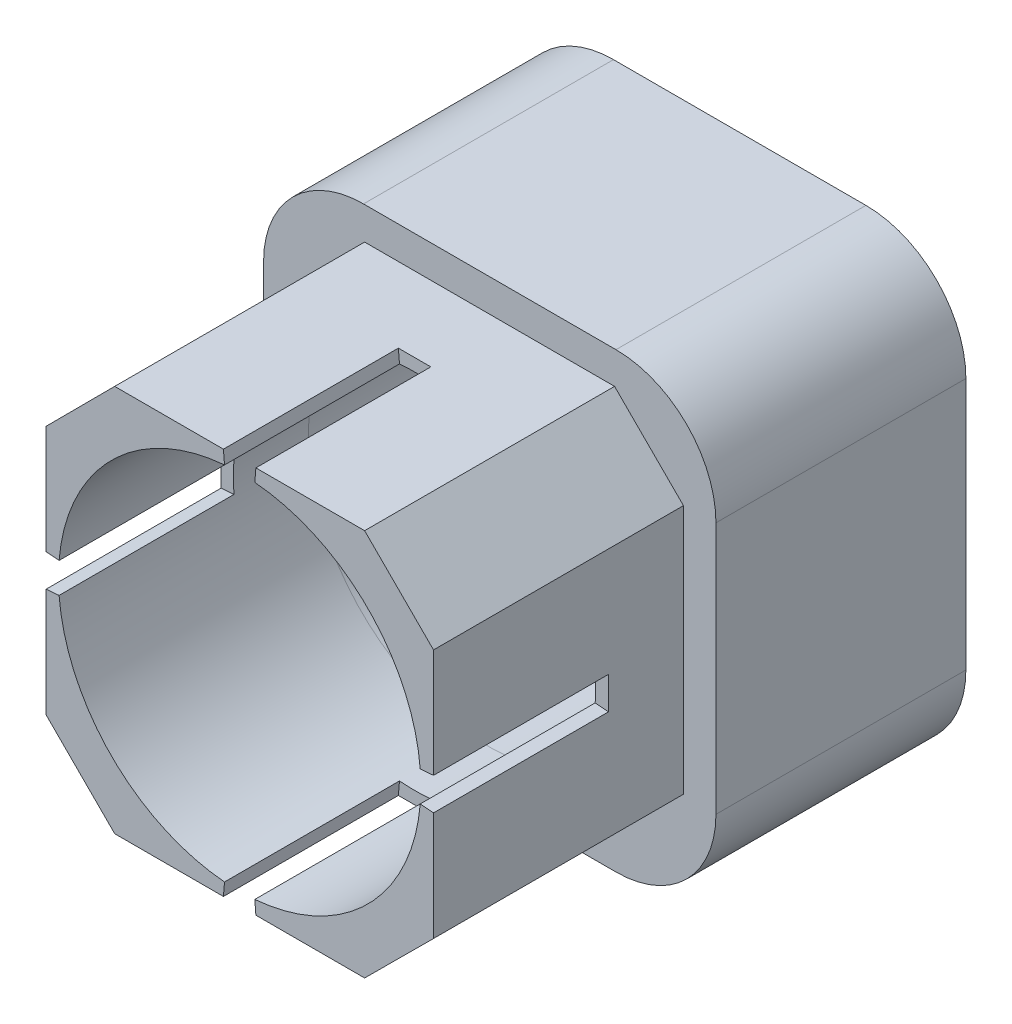
ISO-10303-21;
HEADER;
FILE_DESCRIPTION(('STEP AP214'),'2;1');
FILE_NAME('part.step','',(''),(''),'','','');
FILE_SCHEMA(('AUTOMOTIVE_DESIGN { 1 0 10303 214 1 1 1 1 }'));
ENDSEC;
DATA;
#1=APPLICATION_CONTEXT('core data for automotive mechanical design processes');
#2=APPLICATION_PROTOCOL_DEFINITION('international standard','automotive_design',2000,#1);
#3=PRODUCT_CONTEXT('',#1,'mechanical');
#4=PRODUCT('Part','Part','',(#3));
#5=PRODUCT_RELATED_PRODUCT_CATEGORY('part','',(#4));
#6=PRODUCT_DEFINITION_FORMATION('','',#4);
#7=PRODUCT_DEFINITION_CONTEXT('part definition',#1,'design');
#8=PRODUCT_DEFINITION('design','',#6,#7);
#9=PRODUCT_DEFINITION_SHAPE('','',#8);
#10=(LENGTH_UNIT() NAMED_UNIT(*) SI_UNIT(.MILLI.,.METRE.));
#11=(NAMED_UNIT(*) PLANE_ANGLE_UNIT() SI_UNIT($,.RADIAN.));
#12=(NAMED_UNIT(*) SI_UNIT($,.STERADIAN.) SOLID_ANGLE_UNIT());
#13=UNCERTAINTY_MEASURE_WITH_UNIT(LENGTH_MEASURE(1.E-05),#10,'distance_accuracy_value','');
#14=(GEOMETRIC_REPRESENTATION_CONTEXT(3) GLOBAL_UNCERTAINTY_ASSIGNED_CONTEXT((#13)) GLOBAL_UNIT_ASSIGNED_CONTEXT((#10,
#11,#12)) REPRESENTATION_CONTEXT('',''));
#15=CARTESIAN_POINT('',(0.,0.,0.));
#16=DIRECTION('',(0.,0.,1.));
#17=DIRECTION('',(1.,0.,0.));
#18=AXIS2_PLACEMENT_3D('',#15,#16,#17);
#19=CARTESIAN_POINT('',(0.,0.,20.));
#20=DIRECTION('',(0.,0.,-1.));
#21=DIRECTION('',(-1.,0.,0.));
#22=AXIS2_PLACEMENT_3D('',#19,#20,#21);
#23=PLANE('',#22);
#24=DIRECTION('',(0.,-1.,0.));
#25=VECTOR('',#24,1.);
#26=CARTESIAN_POINT('',(-7.75,-5.00391173497531,20.));
#27=LINE('',#26,#25);
#28=CARTESIAN_POINT('',(-7.75,4.99608826502469,20.));
#29=VERTEX_POINT('',#28);
#30=CARTESIAN_POINT('',(-7.75,0.648910596259412,20.));
#31=VERTEX_POINT('',#30);
#32=EDGE_CURVE('E330',#29,#31,#27,.T.);
#33=ORIENTED_EDGE('',*,*,#32,.T.);
#34=DIRECTION('',(-0.996501278000747,0.0835775265419981,0.));
#35=VECTOR('',#34,1.);
#36=CARTESIAN_POINT('',(-7.76298904459931,0.65,20.));
#37=LINE('',#36,#35);
#38=CARTESIAN_POINT('',(-7.2311741331133,0.605396168714076,20.));
#39=VERTEX_POINT('',#38);
#40=EDGE_CURVE('E530',#39,#31,#37,.T.);
#41=ORIENTED_EDGE('',*,*,#40,.F.);
#42=CARTESIAN_POINT('',(-0.0064945222996559,0.,20.));
#43=DIRECTION('',(0.,0.,1.));
#44=DIRECTION('',(1.,0.,0.));
#45=AXIS2_PLACEMENT_3D('',#42,#43,#44);
#46=CIRCLE('',#45,7.25);
#47=CARTESIAN_POINT('',(-0.611890691013656,7.22467961081365,20.));
#48=VERTEX_POINT('',#47);
#49=EDGE_CURVE('E284',#48,#39,#46,.T.);
#50=ORIENTED_EDGE('',*,*,#49,.F.);
#51=DIRECTION('',(0.0835775265419877,-0.996501278000748,0.));
#52=VECTOR('',#51,1.);
#53=CARTESIAN_POINT('',(-0.00649452229965583,0.0064945222996559,20.));
#54=LINE('',#53,#52);
#55=CARTESIAN_POINT('',(-0.65594982042928,7.75,20.));
#56=VERTEX_POINT('',#55);
#57=EDGE_CURVE('E533',#56,#48,#54,.T.);
#58=ORIENTED_EDGE('',*,*,#57,.F.);
#59=DIRECTION('',(-1.,0.,0.));
#60=VECTOR('',#59,1.);
#61=CARTESIAN_POINT('',(-5.00649452229964,7.75,20.));
#62=LINE('',#61,#60);
#63=CARTESIAN_POINT('',(-5.00649452229964,7.75,20.));
#64=VERTEX_POINT('',#63);
#65=EDGE_CURVE('E321',#56,#64,#62,.T.);
#66=ORIENTED_EDGE('',*,*,#65,.T.);
#67=DIRECTION('',(-0.705767009066908,-0.708444019604055,0.));
#68=VECTOR('',#67,1.);
#69=CARTESIAN_POINT('',(-5.00649452229964,7.75,20.));
#70=LINE('',#69,#68);
#71=EDGE_CURVE('E326',#64,#29,#70,.T.);
#72=ORIENTED_EDGE('',*,*,#71,.T.);
#73=EDGE_LOOP('',(#33,#41,#50,#58,#66,#72));
#74=FACE_BOUND('',#73,.T.);
#75=ADVANCED_FACE('F41',(#74),#23,.F.);
#76=CARTESIAN_POINT('',(4.99350547770034,7.75,20.));
#77=VERTEX_POINT('',#76);
#78=CARTESIAN_POINT('',(0.642960775830132,7.75,20.));
#79=VERTEX_POINT('',#78);
#80=EDGE_CURVE('E322',#77,#79,#62,.T.);
#81=ORIENTED_EDGE('',*,*,#80,.T.);
#82=DIRECTION('',(0.0835775265420086,0.996501278000746,0.));
#83=VECTOR('',#82,1.);
#84=CARTESIAN_POINT('',(0.643505477700425,7.75649452229965,20.));
#85=LINE('',#84,#83);
#86=CARTESIAN_POINT('',(0.598901646414496,7.22467961081363,20.));
#87=VERTEX_POINT('',#86);
#88=EDGE_CURVE('E783',#87,#79,#85,.T.);
#89=ORIENTED_EDGE('',*,*,#88,.F.);
#90=CARTESIAN_POINT('',(7.21818508851398,0.605396168714076,20.));
#91=VERTEX_POINT('',#90);
#92=EDGE_CURVE('E290',#91,#87,#46,.T.);
#93=ORIENTED_EDGE('',*,*,#92,.F.);
#94=DIRECTION('',(-0.996501278000747,-0.0835775265419981,0.));
#95=VECTOR('',#94,1.);
#96=CARTESIAN_POINT('',(0.,0.,20.));
#97=LINE('',#96,#95);
#98=CARTESIAN_POINT('',(7.75,0.65,20.));
#99=VERTEX_POINT('',#98);
#100=EDGE_CURVE('E579',#99,#91,#97,.T.);
#101=ORIENTED_EDGE('',*,*,#100,.F.);
#102=DIRECTION('',(0.,1.,0.));
#103=VECTOR('',#102,1.);
#104=CARTESIAN_POINT('',(7.75,-5.0039117349753,20.));
#105=LINE('',#104,#103);
#106=CARTESIAN_POINT('',(7.75,4.99608826502469,20.));
#107=VERTEX_POINT('',#106);
#108=EDGE_CURVE('E313',#99,#107,#105,.T.);
#109=ORIENTED_EDGE('',*,*,#108,.T.);
#110=DIRECTION('',(-0.70743813211437,0.706775274914545,0.));
#111=VECTOR('',#110,1.);
#112=CARTESIAN_POINT('',(4.99350547770034,7.75,20.));
#113=LINE('',#112,#111);
#114=EDGE_CURVE('E318',#107,#77,#113,.T.);
#115=ORIENTED_EDGE('',*,*,#114,.T.);
#116=EDGE_LOOP('',(#81,#89,#93,#101,#109,#115));
#117=FACE_BOUND('',#116,.T.);
#118=ADVANCED_FACE('F622',(#117),#23,.F.);
#119=CARTESIAN_POINT('',(-7.2311741331133,-0.605396168714076,20.));
#120=VERTEX_POINT('',#119);
#121=CARTESIAN_POINT('',(-0.611890691013757,-7.22467961081364,20.));
#122=VERTEX_POINT('',#121);
#123=EDGE_CURVE('E272',#120,#122,#46,.T.);
#124=ORIENTED_EDGE('',*,*,#123,.F.);
#125=DIRECTION('',(0.996501278000747,0.0835775265419981,0.));
#126=VECTOR('',#125,1.);
#127=CARTESIAN_POINT('',(-0.0129890445993118,0.,20.));
#128=LINE('',#127,#126);
#129=CARTESIAN_POINT('',(-7.75,-0.648910596259412,20.));
#130=VERTEX_POINT('',#129);
#131=EDGE_CURVE('E514',#130,#120,#128,.T.);
#132=ORIENTED_EDGE('',*,*,#131,.F.);
#133=CARTESIAN_POINT('',(-7.75,-5.00391173497531,20.));
#134=VERTEX_POINT('',#133);
#135=EDGE_CURVE('E329',#130,#134,#27,.T.);
#136=ORIENTED_EDGE('',*,*,#135,.T.);
#137=DIRECTION('',(0.706774017790505,-0.707439388058276,0.));
#138=VECTOR('',#137,1.);
#139=CARTESIAN_POINT('',(-5.00649452229966,-7.75,20.));
#140=LINE('',#139,#138);
#141=CARTESIAN_POINT('',(-5.00649452229966,-7.75,20.));
#142=VERTEX_POINT('',#141);
#143=EDGE_CURVE('E303',#134,#142,#140,.T.);
#144=ORIENTED_EDGE('',*,*,#143,.T.);
#145=DIRECTION('',(1.,0.,0.));
#146=VECTOR('',#145,1.);
#147=CARTESIAN_POINT('',(-5.00649452229966,-7.75,20.));
#148=LINE('',#147,#146);
#149=CARTESIAN_POINT('',(-0.65594982042939,-7.75,20.));
#150=VERTEX_POINT('',#149);
#151=EDGE_CURVE('E274',#142,#150,#148,.T.);
#152=ORIENTED_EDGE('',*,*,#151,.T.);
#153=DIRECTION('',(-0.0835775265420016,-0.996501278000747,0.));
#154=VECTOR('',#153,1.);
#155=CARTESIAN_POINT('',(-0.656494522299683,-7.75649452229965,20.));
#156=LINE('',#155,#154);
#157=EDGE_CURVE('E256',#122,#150,#156,.T.);
#158=ORIENTED_EDGE('',*,*,#157,.F.);
#159=EDGE_LOOP('',(#124,#132,#136,#144,#152,#158));
#160=FACE_BOUND('',#159,.T.);
#161=ADVANCED_FACE('F270',(#160),#23,.F.);
#162=CARTESIAN_POINT('',(5.05,5.05,10.));
#163=DIRECTION('',(0.,0.,-1.));
#164=DIRECTION('',(-1.,0.,0.));
#165=AXIS2_PLACEMENT_3D('',#162,#163,#164);
#166=CYLINDRICAL_SURFACE('',#165,4.00000000000001);
#167=CARTESIAN_POINT('',(5.05,5.05,0.));
#168=DIRECTION('',(0.,0.,1.));
#169=DIRECTION('',(-1.,0.,0.));
#170=AXIS2_PLACEMENT_3D('',#167,#168,#169);
#171=CIRCLE('',#170,4.00000000000001);
#172=CARTESIAN_POINT('',(9.05,5.05,0.));
#173=VERTEX_POINT('',#172);
#174=CARTESIAN_POINT('',(5.05,9.05,0.));
#175=VERTEX_POINT('',#174);
#176=EDGE_CURVE('E396',#173,#175,#171,.T.);
#177=ORIENTED_EDGE('',*,*,#176,.T.);
#178=DIRECTION('',(0.,0.,-1.));
#179=VECTOR('',#178,1.);
#180=CARTESIAN_POINT('',(5.05,9.05,10.));
#181=LINE('',#180,#179);
#182=CARTESIAN_POINT('',(5.05,9.05,10.));
#183=VERTEX_POINT('',#182);
#184=EDGE_CURVE('E474',#183,#175,#181,.T.);
#185=ORIENTED_EDGE('',*,*,#184,.F.);
#186=CARTESIAN_POINT('',(5.05,5.05,10.));
#187=DIRECTION('',(0.,0.,1.));
#188=DIRECTION('',(-1.,0.,0.));
#189=AXIS2_PLACEMENT_3D('',#186,#187,#188);
#190=CIRCLE('',#189,4.00000000000001);
#191=CARTESIAN_POINT('',(9.05,5.05,10.));
#192=VERTEX_POINT('',#191);
#193=EDGE_CURVE('E397',#192,#183,#190,.T.);
#194=ORIENTED_EDGE('',*,*,#193,.F.);
#195=DIRECTION('',(0.,0.,-1.));
#196=VECTOR('',#195,1.);
#197=CARTESIAN_POINT('',(9.05,5.05,10.));
#198=LINE('',#197,#196);
#199=EDGE_CURVE('E423',#192,#173,#198,.T.);
#200=ORIENTED_EDGE('',*,*,#199,.T.);
#201=EDGE_LOOP('',(#177,#185,#194,#200));
#202=FACE_BOUND('',#201,.T.);
#203=ADVANCED_FACE('F43',(#202),#166,.T.);
#204=CARTESIAN_POINT('',(-5.05,9.05,10.));
#205=DIRECTION('',(0.,-1.,0.));
#206=DIRECTION('',(0.,0.,-1.));
#207=AXIS2_PLACEMENT_3D('',#204,#205,#206);
#208=PLANE('',#207);
#209=DIRECTION('',(-1.,0.,0.));
#210=VECTOR('',#209,1.);
#211=CARTESIAN_POINT('',(-5.05,9.05,0.));
#212=LINE('',#211,#210);
#213=CARTESIAN_POINT('',(-5.05,9.05,0.));
#214=VERTEX_POINT('',#213);
#215=EDGE_CURVE('E427',#175,#214,#212,.T.);
#216=ORIENTED_EDGE('',*,*,#215,.T.);
#217=DIRECTION('',(0.,0.,-1.));
#218=VECTOR('',#217,1.);
#219=CARTESIAN_POINT('',(-5.05,9.05,10.));
#220=LINE('',#219,#218);
#221=CARTESIAN_POINT('',(-5.05,9.05,10.));
#222=VERTEX_POINT('',#221);
#223=EDGE_CURVE('E470',#222,#214,#220,.T.);
#224=ORIENTED_EDGE('',*,*,#223,.F.);
#225=DIRECTION('',(-1.,0.,0.));
#226=VECTOR('',#225,1.);
#227=CARTESIAN_POINT('',(-5.05,9.05,10.));
#228=LINE('',#227,#226);
#229=EDGE_CURVE('E401',#183,#222,#228,.T.);
#230=ORIENTED_EDGE('',*,*,#229,.F.);
#231=ORIENTED_EDGE('',*,*,#184,.T.);
#232=EDGE_LOOP('',(#216,#224,#230,#231));
#233=FACE_BOUND('',#232,.T.);
#234=ADVANCED_FACE('F680',(#233),#208,.F.);
#235=CARTESIAN_POINT('',(-5.04999999999999,5.04999999999999,10.));
#236=DIRECTION('',(0.,0.,-1.));
#237=DIRECTION('',(-1.,0.,0.));
#238=AXIS2_PLACEMENT_3D('',#235,#236,#237);
#239=CYLINDRICAL_SURFACE('',#238,4.00000000000002);
#240=CARTESIAN_POINT('',(-5.04999999999999,5.04999999999999,0.));
#241=DIRECTION('',(0.,0.,1.));
#242=DIRECTION('',(-1.,0.,0.));
#243=AXIS2_PLACEMENT_3D('',#240,#241,#242);
#244=CIRCLE('',#243,4.00000000000002);
#245=CARTESIAN_POINT('',(-9.05,5.05,0.));
#246=VERTEX_POINT('',#245);
#247=EDGE_CURVE('E430',#214,#246,#244,.T.);
#248=ORIENTED_EDGE('',*,*,#247,.T.);
#249=DIRECTION('',(0.,0.,-1.));
#250=VECTOR('',#249,1.);
#251=CARTESIAN_POINT('',(-9.05,5.05,10.));
#252=LINE('',#251,#250);
#253=CARTESIAN_POINT('',(-9.05,5.05,10.));
#254=VERTEX_POINT('',#253);
#255=EDGE_CURVE('E466',#254,#246,#252,.T.);
#256=ORIENTED_EDGE('',*,*,#255,.F.);
#257=CARTESIAN_POINT('',(-5.04999999999999,5.04999999999999,10.));
#258=DIRECTION('',(0.,0.,1.));
#259=DIRECTION('',(-1.,0.,0.));
#260=AXIS2_PLACEMENT_3D('',#257,#258,#259);
#261=CIRCLE('',#260,4.00000000000002);
#262=EDGE_CURVE('E405',#222,#254,#261,.T.);
#263=ORIENTED_EDGE('',*,*,#262,.F.);
#264=ORIENTED_EDGE('',*,*,#223,.T.);
#265=EDGE_LOOP('',(#248,#256,#263,#264));
#266=FACE_BOUND('',#265,.T.);
#267=ADVANCED_FACE('F685',(#266),#239,.T.);
#268=CARTESIAN_POINT('',(-9.05,-5.05,10.));
#269=DIRECTION('',(1.,0.,0.));
#270=DIRECTION('',(0.,0.,-1.));
#271=AXIS2_PLACEMENT_3D('',#268,#269,#270);
#272=PLANE('',#271);
#273=DIRECTION('',(0.,-1.,0.));
#274=VECTOR('',#273,1.);
#275=CARTESIAN_POINT('',(-9.05,-5.05,0.));
#276=LINE('',#275,#274);
#277=CARTESIAN_POINT('',(-9.05,-5.05,0.));
#278=VERTEX_POINT('',#277);
#279=EDGE_CURVE('E433',#246,#278,#276,.T.);
#280=ORIENTED_EDGE('',*,*,#279,.T.);
#281=DIRECTION('',(0.,0.,-1.));
#282=VECTOR('',#281,1.);
#283=CARTESIAN_POINT('',(-9.05,-5.05,10.));
#284=LINE('',#283,#282);
#285=CARTESIAN_POINT('',(-9.05,-5.05,10.));
#286=VERTEX_POINT('',#285);
#287=EDGE_CURVE('E462',#286,#278,#284,.T.);
#288=ORIENTED_EDGE('',*,*,#287,.F.);
#289=DIRECTION('',(0.,-1.,0.));
#290=VECTOR('',#289,1.);
#291=CARTESIAN_POINT('',(-9.05,-5.05,10.));
#292=LINE('',#291,#290);
#293=EDGE_CURVE('E408',#254,#286,#292,.T.);
#294=ORIENTED_EDGE('',*,*,#293,.F.);
#295=ORIENTED_EDGE('',*,*,#255,.T.);
#296=EDGE_LOOP('',(#280,#288,#294,#295));
#297=FACE_BOUND('',#296,.T.);
#298=ADVANCED_FACE('F719',(#297),#272,.F.);
#299=CARTESIAN_POINT('',(-5.04999999999999,-5.04999999999999,10.));
#300=DIRECTION('',(0.,0.,-1.));
#301=DIRECTION('',(-1.,0.,0.));
#302=AXIS2_PLACEMENT_3D('',#299,#300,#301);
#303=CYLINDRICAL_SURFACE('',#302,4.00000000000001);
#304=CARTESIAN_POINT('',(-5.04999999999999,-5.04999999999999,0.));
#305=DIRECTION('',(0.,0.,1.));
#306=DIRECTION('',(-1.,0.,0.));
#307=AXIS2_PLACEMENT_3D('',#304,#305,#306);
#308=CIRCLE('',#307,4.00000000000001);
#309=CARTESIAN_POINT('',(-5.05,-9.05,0.));
#310=VERTEX_POINT('',#309);
#311=EDGE_CURVE('E436',#278,#310,#308,.T.);
#312=ORIENTED_EDGE('',*,*,#311,.T.);
#313=DIRECTION('',(0.,0.,-1.));
#314=VECTOR('',#313,1.);
#315=CARTESIAN_POINT('',(-5.05,-9.05,10.));
#316=LINE('',#315,#314);
#317=CARTESIAN_POINT('',(-5.05,-9.05,10.));
#318=VERTEX_POINT('',#317);
#319=EDGE_CURVE('E458',#318,#310,#316,.T.);
#320=ORIENTED_EDGE('',*,*,#319,.F.);
#321=CARTESIAN_POINT('',(-5.04999999999999,-5.04999999999999,10.));
#322=DIRECTION('',(0.,0.,1.));
#323=DIRECTION('',(-1.,0.,0.));
#324=AXIS2_PLACEMENT_3D('',#321,#322,#323);
#325=CIRCLE('',#324,4.00000000000001);
#326=EDGE_CURVE('E411',#286,#318,#325,.T.);
#327=ORIENTED_EDGE('',*,*,#326,.F.);
#328=ORIENTED_EDGE('',*,*,#287,.T.);
#329=EDGE_LOOP('',(#312,#320,#327,#328));
#330=FACE_BOUND('',#329,.T.);
#331=ADVANCED_FACE('F715',(#330),#303,.T.);
#332=CARTESIAN_POINT('',(-5.05,-9.05,10.));
#333=DIRECTION('',(0.,1.,0.));
#334=DIRECTION('',(0.,0.,1.));
#335=AXIS2_PLACEMENT_3D('',#332,#333,#334);
#336=PLANE('',#335);
#337=DIRECTION('',(1.,0.,0.));
#338=VECTOR('',#337,1.);
#339=CARTESIAN_POINT('',(-5.05,-9.05,0.));
#340=LINE('',#339,#338);
#341=CARTESIAN_POINT('',(5.05,-9.05,0.));
#342=VERTEX_POINT('',#341);
#343=EDGE_CURVE('E439',#310,#342,#340,.T.);
#344=ORIENTED_EDGE('',*,*,#343,.T.);
#345=DIRECTION('',(0.,0.,-1.));
#346=VECTOR('',#345,1.);
#347=CARTESIAN_POINT('',(5.05,-9.05,10.));
#348=LINE('',#347,#346);
#349=CARTESIAN_POINT('',(5.05,-9.05,10.));
#350=VERTEX_POINT('',#349);
#351=EDGE_CURVE('E454',#350,#342,#348,.T.);
#352=ORIENTED_EDGE('',*,*,#351,.F.);
#353=DIRECTION('',(1.,0.,0.));
#354=VECTOR('',#353,1.);
#355=CARTESIAN_POINT('',(-5.05,-9.05,10.));
#356=LINE('',#355,#354);
#357=EDGE_CURVE('E414',#318,#350,#356,.T.);
#358=ORIENTED_EDGE('',*,*,#357,.F.);
#359=ORIENTED_EDGE('',*,*,#319,.T.);
#360=EDGE_LOOP('',(#344,#352,#358,#359));
#361=FACE_BOUND('',#360,.T.);
#362=ADVANCED_FACE('F710',(#361),#336,.F.);
#363=CARTESIAN_POINT('',(5.04999999999999,-5.04999999999999,10.));
#364=DIRECTION('',(0.,0.,-1.));
#365=DIRECTION('',(-1.,0.,0.));
#366=AXIS2_PLACEMENT_3D('',#363,#364,#365);
#367=CYLINDRICAL_SURFACE('',#366,4.00000000000001);
#368=CARTESIAN_POINT('',(5.04999999999999,-5.04999999999999,0.));
#369=DIRECTION('',(0.,0.,1.));
#370=DIRECTION('',(-1.,0.,0.));
#371=AXIS2_PLACEMENT_3D('',#368,#369,#370);
#372=CIRCLE('',#371,4.00000000000001);
#373=CARTESIAN_POINT('',(9.05,-5.05,0.));
#374=VERTEX_POINT('',#373);
#375=EDGE_CURVE('E442',#342,#374,#372,.T.);
#376=ORIENTED_EDGE('',*,*,#375,.T.);
#377=DIRECTION('',(0.,0.,-1.));
#378=VECTOR('',#377,1.);
#379=CARTESIAN_POINT('',(9.05,-5.05,10.));
#380=LINE('',#379,#378);
#381=CARTESIAN_POINT('',(9.05,-5.05,10.));
#382=VERTEX_POINT('',#381);
#383=EDGE_CURVE('E450',#382,#374,#380,.T.);
#384=ORIENTED_EDGE('',*,*,#383,.F.);
#385=CARTESIAN_POINT('',(5.04999999999999,-5.04999999999999,10.));
#386=DIRECTION('',(0.,0.,1.));
#387=DIRECTION('',(-1.,0.,0.));
#388=AXIS2_PLACEMENT_3D('',#385,#386,#387);
#389=CIRCLE('',#388,4.00000000000001);
#390=EDGE_CURVE('E417',#350,#382,#389,.T.);
#391=ORIENTED_EDGE('',*,*,#390,.F.);
#392=ORIENTED_EDGE('',*,*,#351,.T.);
#393=EDGE_LOOP('',(#376,#384,#391,#392));
#394=FACE_BOUND('',#393,.T.);
#395=ADVANCED_FACE('F705',(#394),#367,.T.);
#396=CARTESIAN_POINT('',(9.05,-5.05,10.));
#397=DIRECTION('',(-1.,0.,0.));
#398=DIRECTION('',(0.,0.,1.));
#399=AXIS2_PLACEMENT_3D('',#396,#397,#398);
#400=PLANE('',#399);
#401=DIRECTION('',(0.,1.,0.));
#402=VECTOR('',#401,1.);
#403=CARTESIAN_POINT('',(9.05,-5.05,0.));
#404=LINE('',#403,#402);
#405=EDGE_CURVE('E402',#374,#173,#404,.T.);
#406=ORIENTED_EDGE('',*,*,#405,.T.);
#407=ORIENTED_EDGE('',*,*,#199,.F.);
#408=DIRECTION('',(0.,1.,0.));
#409=VECTOR('',#408,1.);
#410=CARTESIAN_POINT('',(9.05,-5.05,10.));
#411=LINE('',#410,#409);
#412=EDGE_CURVE('E420',#382,#192,#411,.T.);
#413=ORIENTED_EDGE('',*,*,#412,.F.);
#414=ORIENTED_EDGE('',*,*,#383,.T.);
#415=EDGE_LOOP('',(#406,#407,#413,#414));
#416=FACE_BOUND('',#415,.T.);
#417=ADVANCED_FACE('F703',(#416),#400,.F.);
#418=CARTESIAN_POINT('',(5.05,5.05,10.));
#419=DIRECTION('',(0.,0.,-1.));
#420=DIRECTION('',(-1.,0.,0.));
#421=AXIS2_PLACEMENT_3D('',#418,#419,#420);
#422=PLANE('',#421);
#423=DIRECTION('',(0.706774017790505,-0.707439388058276,0.));
#424=VECTOR('',#423,1.);
#425=CARTESIAN_POINT('',(-5.00649452229966,-7.75,10.));
#426=LINE('',#425,#424);
#427=CARTESIAN_POINT('',(-7.75,-5.00391173497531,10.));
#428=VERTEX_POINT('',#427);
#429=CARTESIAN_POINT('',(-5.00649452229966,-7.75,10.));
#430=VERTEX_POINT('',#429);
#431=EDGE_CURVE('E296',#428,#430,#426,.T.);
#432=ORIENTED_EDGE('',*,*,#431,.F.);
#433=DIRECTION('',(0.,-1.,0.));
#434=VECTOR('',#433,1.);
#435=CARTESIAN_POINT('',(-7.75,-5.00391173497531,10.));
#436=LINE('',#435,#434);
#437=CARTESIAN_POINT('',(-7.75,4.99608826502469,10.));
#438=VERTEX_POINT('',#437);
#439=EDGE_CURVE('E307',#438,#428,#436,.T.);
#440=ORIENTED_EDGE('',*,*,#439,.F.);
#441=DIRECTION('',(-0.705767009066908,-0.708444019604055,0.));
#442=VECTOR('',#441,1.);
#443=CARTESIAN_POINT('',(-5.00649452229964,7.75,10.));
#444=LINE('',#443,#442);
#445=CARTESIAN_POINT('',(-5.00649452229965,7.75,10.));
#446=VERTEX_POINT('',#445);
#447=EDGE_CURVE('E358',#446,#438,#444,.T.);
#448=ORIENTED_EDGE('',*,*,#447,.F.);
#449=DIRECTION('',(-1.,0.,0.));
#450=VECTOR('',#449,1.);
#451=CARTESIAN_POINT('',(-5.00649452229964,7.75,10.));
#452=LINE('',#451,#450);
#453=CARTESIAN_POINT('',(4.99350547770034,7.75,10.));
#454=VERTEX_POINT('',#453);
#455=EDGE_CURVE('E354',#454,#446,#452,.T.);
#456=ORIENTED_EDGE('',*,*,#455,.F.);
#457=DIRECTION('',(-0.70743813211437,0.706775274914545,0.));
#458=VECTOR('',#457,1.);
#459=CARTESIAN_POINT('',(4.99350547770034,7.75,10.));
#460=LINE('',#459,#458);
#461=CARTESIAN_POINT('',(7.75,4.99608826502469,10.));
#462=VERTEX_POINT('',#461);
#463=EDGE_CURVE('E350',#462,#454,#460,.T.);
#464=ORIENTED_EDGE('',*,*,#463,.F.);
#465=DIRECTION('',(0.,1.,0.));
#466=VECTOR('',#465,1.);
#467=CARTESIAN_POINT('',(7.75,-5.0039117349753,10.));
#468=LINE('',#467,#466);
#469=CARTESIAN_POINT('',(7.75,-5.0039117349753,10.));
#470=VERTEX_POINT('',#469);
#471=EDGE_CURVE('E346',#470,#462,#468,.T.);
#472=ORIENTED_EDGE('',*,*,#471,.F.);
#473=DIRECTION('',(0.708442765458039,0.705768267967728,0.));
#474=VECTOR('',#473,1.);
#475=CARTESIAN_POINT('',(4.99350547770033,-7.75,10.));
#476=LINE('',#475,#474);
#477=CARTESIAN_POINT('',(4.99350547770033,-7.75,10.));
#478=VERTEX_POINT('',#477);
#479=EDGE_CURVE('E342',#478,#470,#476,.T.);
#480=ORIENTED_EDGE('',*,*,#479,.F.);
#481=DIRECTION('',(1.,0.,0.));
#482=VECTOR('',#481,1.);
#483=CARTESIAN_POINT('',(-5.00649452229966,-7.75,10.));
#484=LINE('',#483,#482);
#485=EDGE_CURVE('E338',#430,#478,#484,.T.);
#486=ORIENTED_EDGE('',*,*,#485,.F.);
#487=EDGE_LOOP('',(#432,#440,#448,#456,#464,#472,#480,#486));
#488=FACE_BOUND('',#487,.T.);
#489=ORIENTED_EDGE('',*,*,#193,.T.);
#490=ORIENTED_EDGE('',*,*,#229,.T.);
#491=ORIENTED_EDGE('',*,*,#262,.T.);
#492=ORIENTED_EDGE('',*,*,#293,.T.);
#493=ORIENTED_EDGE('',*,*,#326,.T.);
#494=ORIENTED_EDGE('',*,*,#357,.T.);
#495=ORIENTED_EDGE('',*,*,#390,.T.);
#496=ORIENTED_EDGE('',*,*,#412,.T.);
#497=EDGE_LOOP('',(#489,#490,#491,#492,#493,#494,#495,#496));
#498=FACE_BOUND('',#497,.T.);
#499=ADVANCED_FACE('F673',(#488,#498),#422,.F.);
#500=CARTESIAN_POINT('',(5.05,5.05,0.));
#501=DIRECTION('',(0.,0.,-1.));
#502=DIRECTION('',(-1.,0.,0.));
#503=AXIS2_PLACEMENT_3D('',#500,#501,#502);
#504=PLANE('',#503);
#505=CARTESIAN_POINT('',(0.,0.,0.));
#506=DIRECTION('',(0.,0.,-1.));
#507=DIRECTION('',(-1.,0.,0.));
#508=AXIS2_PLACEMENT_3D('',#505,#506,#507);
#509=CIRCLE('',#508,7.25649452229966);
#510=CARTESIAN_POINT('',(-7.25649452229966,0.,0.));
#511=VERTEX_POINT('',#510);
#512=EDGE_CURVE('E302',#511,#511,#509,.T.);
#513=ORIENTED_EDGE('',*,*,#512,.F.);
#514=EDGE_LOOP('',(#513));
#515=FACE_BOUND('',#514,.T.);
#516=ORIENTED_EDGE('',*,*,#176,.F.);
#517=ORIENTED_EDGE('',*,*,#405,.F.);
#518=ORIENTED_EDGE('',*,*,#375,.F.);
#519=ORIENTED_EDGE('',*,*,#343,.F.);
#520=ORIENTED_EDGE('',*,*,#311,.F.);
#521=ORIENTED_EDGE('',*,*,#279,.F.);
#522=ORIENTED_EDGE('',*,*,#247,.F.);
#523=ORIENTED_EDGE('',*,*,#215,.F.);
#524=EDGE_LOOP('',(#516,#517,#518,#519,#520,#521,#522,#523));
#525=FACE_BOUND('',#524,.T.);
#526=ADVANCED_FACE('F667',(#515,#525),#504,.T.);
#527=CARTESIAN_POINT('',(0.598901646414395,-7.22467961081364,20.));
#528=VERTEX_POINT('',#527);
#529=CARTESIAN_POINT('',(7.21818508851398,-0.605396168714076,20.));
#530=VERTEX_POINT('',#529);
#531=EDGE_CURVE('E285',#528,#530,#46,.T.);
#532=ORIENTED_EDGE('',*,*,#531,.F.);
#533=DIRECTION('',(-0.0835775265419946,0.996501278000747,0.));
#534=VECTOR('',#533,1.);
#535=CARTESIAN_POINT('',(-0.00649452229965592,-0.0064945222996559,20.));
#536=LINE('',#535,#534);
#537=CARTESIAN_POINT('',(0.642960775830023,-7.75,20.));
#538=VERTEX_POINT('',#537);
#539=EDGE_CURVE('E276',#538,#528,#536,.T.);
#540=ORIENTED_EDGE('',*,*,#539,.F.);
#541=CARTESIAN_POINT('',(4.99350547770033,-7.75,20.));
#542=VERTEX_POINT('',#541);
#543=EDGE_CURVE('E306',#538,#542,#148,.T.);
#544=ORIENTED_EDGE('',*,*,#543,.T.);
#545=DIRECTION('',(0.708442765458039,0.705768267967728,0.));
#546=VECTOR('',#545,1.);
#547=CARTESIAN_POINT('',(4.99350547770033,-7.75,20.));
#548=LINE('',#547,#546);
#549=CARTESIAN_POINT('',(7.75,-5.0039117349753,20.));
#550=VERTEX_POINT('',#549);
#551=EDGE_CURVE('E310',#542,#550,#548,.T.);
#552=ORIENTED_EDGE('',*,*,#551,.T.);
#553=CARTESIAN_POINT('',(7.75,-0.65,20.));
#554=VERTEX_POINT('',#553);
#555=EDGE_CURVE('E314',#550,#554,#105,.T.);
#556=ORIENTED_EDGE('',*,*,#555,.T.);
#557=DIRECTION('',(0.996501278000747,-0.0835775265419981,0.));
#558=VECTOR('',#557,1.);
#559=CARTESIAN_POINT('',(7.75,-0.65,20.));
#560=LINE('',#559,#558);
#561=EDGE_CURVE('E574',#530,#554,#560,.T.);
#562=ORIENTED_EDGE('',*,*,#561,.F.);
#563=EDGE_LOOP('',(#532,#540,#544,#552,#556,#562));
#564=FACE_BOUND('',#563,.T.);
#565=ADVANCED_FACE('F605',(#564),#23,.F.);
#566=CARTESIAN_POINT('',(-5.00649452229966,-7.75,20.));
#567=DIRECTION('',(0.707439388058276,0.706774017790505,0.));
#568=DIRECTION('',(-0.706774017790505,0.707439388058276,0.));
#569=AXIS2_PLACEMENT_3D('',#566,#567,#568);
#570=PLANE('',#569);
#571=ORIENTED_EDGE('',*,*,#431,.T.);
#572=DIRECTION('',(0.,0.,-1.));
#573=VECTOR('',#572,1.);
#574=CARTESIAN_POINT('',(-5.00649452229966,-7.75,20.));
#575=LINE('',#574,#573);
#576=EDGE_CURVE('E392',#142,#430,#575,.T.);
#577=ORIENTED_EDGE('',*,*,#576,.F.);
#578=ORIENTED_EDGE('',*,*,#143,.F.);
#579=DIRECTION('',(0.,0.,-1.));
#580=VECTOR('',#579,1.);
#581=CARTESIAN_POINT('',(-7.75,-5.00391173497531,20.));
#582=LINE('',#581,#580);
#583=EDGE_CURVE('E334',#134,#428,#582,.T.);
#584=ORIENTED_EDGE('',*,*,#583,.T.);
#585=EDGE_LOOP('',(#571,#577,#578,#584));
#586=FACE_BOUND('',#585,.T.);
#587=ADVANCED_FACE('F637',(#586),#570,.F.);
#588=CARTESIAN_POINT('',(-5.00649452229966,-7.75,20.));
#589=DIRECTION('',(0.,1.,0.));
#590=DIRECTION('',(0.,0.,1.));
#591=AXIS2_PLACEMENT_3D('',#588,#589,#590);
#592=PLANE('',#591);
#593=DIRECTION('',(1.,0.,0.));
#594=VECTOR('',#593,1.);
#595=CARTESIAN_POINT('',(-5.00649452229966,-7.75,13.));
#596=LINE('',#595,#594);
#597=CARTESIAN_POINT('',(-0.65594982042939,-7.75,13.));
#598=VERTEX_POINT('',#597);
#599=CARTESIAN_POINT('',(0.642960775830023,-7.75,13.));
#600=VERTEX_POINT('',#599);
#601=EDGE_CURVE('E542',#598,#600,#596,.T.);
#602=ORIENTED_EDGE('',*,*,#601,.F.);
#603=DIRECTION('',(0.,0.,1.));
#604=VECTOR('',#603,1.);
#605=CARTESIAN_POINT('',(-0.65594982042939,-7.75,20.));
#606=LINE('',#605,#604);
#607=EDGE_CURVE('E552',#598,#150,#606,.T.);
#608=ORIENTED_EDGE('',*,*,#607,.T.);
#609=ORIENTED_EDGE('',*,*,#151,.F.);
#610=ORIENTED_EDGE('',*,*,#576,.T.);
#611=ORIENTED_EDGE('',*,*,#485,.T.);
#612=DIRECTION('',(0.,0.,-1.));
#613=VECTOR('',#612,1.);
#614=CARTESIAN_POINT('',(4.99350547770033,-7.75,20.));
#615=LINE('',#614,#613);
#616=EDGE_CURVE('E388',#542,#478,#615,.T.);
#617=ORIENTED_EDGE('',*,*,#616,.F.);
#618=ORIENTED_EDGE('',*,*,#543,.F.);
#619=DIRECTION('',(0.,0.,-1.));
#620=VECTOR('',#619,1.);
#621=CARTESIAN_POINT('',(0.642960775830023,-7.75,20.));
#622=LINE('',#621,#620);
#623=EDGE_CURVE('E548',#538,#600,#622,.T.);
#624=ORIENTED_EDGE('',*,*,#623,.T.);
#625=EDGE_LOOP('',(#602,#608,#609,#610,#611,#617,#618,#624));
#626=FACE_BOUND('',#625,.T.);
#627=ADVANCED_FACE('F640',(#626),#592,.F.);
#628=CARTESIAN_POINT('',(4.99350547770033,-7.75,20.));
#629=DIRECTION('',(-0.705768267967728,0.708442765458039,0.));
#630=DIRECTION('',(-0.708442765458039,-0.705768267967728,0.));
#631=AXIS2_PLACEMENT_3D('',#628,#629,#630);
#632=PLANE('',#631);
#633=ORIENTED_EDGE('',*,*,#479,.T.);
#634=DIRECTION('',(0.,0.,-1.));
#635=VECTOR('',#634,1.);
#636=CARTESIAN_POINT('',(7.75,-5.0039117349753,20.));
#637=LINE('',#636,#635);
#638=EDGE_CURVE('E384',#550,#470,#637,.T.);
#639=ORIENTED_EDGE('',*,*,#638,.F.);
#640=ORIENTED_EDGE('',*,*,#551,.F.);
#641=ORIENTED_EDGE('',*,*,#616,.T.);
#642=EDGE_LOOP('',(#633,#639,#640,#641));
#643=FACE_BOUND('',#642,.T.);
#644=ADVANCED_FACE('F612',(#643),#632,.F.);
#645=CARTESIAN_POINT('',(7.75,-5.0039117349753,20.));
#646=DIRECTION('',(-1.,0.,0.));
#647=DIRECTION('',(0.,0.,1.));
#648=AXIS2_PLACEMENT_3D('',#645,#646,#647);
#649=PLANE('',#648);
#650=DIRECTION('',(0.,1.,0.));
#651=VECTOR('',#650,1.);
#652=CARTESIAN_POINT('',(7.75,0.65,13.));
#653=LINE('',#652,#651);
#654=CARTESIAN_POINT('',(7.75,-0.65,13.));
#655=VERTEX_POINT('',#654);
#656=CARTESIAN_POINT('',(7.75,0.65,13.));
#657=VERTEX_POINT('',#656);
#658=EDGE_CURVE('E578',#655,#657,#653,.T.);
#659=ORIENTED_EDGE('',*,*,#658,.F.);
#660=DIRECTION('',(0.,0.,1.));
#661=VECTOR('',#660,1.);
#662=CARTESIAN_POINT('',(7.75,-0.65,13.));
#663=LINE('',#662,#661);
#664=EDGE_CURVE('E585',#655,#554,#663,.T.);
#665=ORIENTED_EDGE('',*,*,#664,.T.);
#666=ORIENTED_EDGE('',*,*,#555,.F.);
#667=ORIENTED_EDGE('',*,*,#638,.T.);
#668=ORIENTED_EDGE('',*,*,#471,.T.);
#669=DIRECTION('',(0.,0.,-1.));
#670=VECTOR('',#669,1.);
#671=CARTESIAN_POINT('',(7.75,4.99608826502469,20.));
#672=LINE('',#671,#670);
#673=EDGE_CURVE('E380',#107,#462,#672,.T.);
#674=ORIENTED_EDGE('',*,*,#673,.F.);
#675=ORIENTED_EDGE('',*,*,#108,.F.);
#676=DIRECTION('',(0.,0.,1.));
#677=VECTOR('',#676,1.);
#678=CARTESIAN_POINT('',(7.75,0.65,13.));
#679=LINE('',#678,#677);
#680=EDGE_CURVE('E590',#657,#99,#679,.T.);
#681=ORIENTED_EDGE('',*,*,#680,.F.);
#682=EDGE_LOOP('',(#659,#665,#666,#667,#668,#674,#675,#681));
#683=FACE_BOUND('',#682,.T.);
#684=ADVANCED_FACE('F598',(#683),#649,.F.);
#685=CARTESIAN_POINT('',(4.99350547770034,7.75,20.));
#686=DIRECTION('',(-0.706775274914545,-0.70743813211437,0.));
#687=DIRECTION('',(0.70743813211437,-0.706775274914546,0.));
#688=AXIS2_PLACEMENT_3D('',#685,#686,#687);
#689=PLANE('',#688);
#690=ORIENTED_EDGE('',*,*,#463,.T.);
#691=DIRECTION('',(0.,0.,-1.));
#692=VECTOR('',#691,1.);
#693=CARTESIAN_POINT('',(4.99350547770034,7.75,20.));
#694=LINE('',#693,#692);
#695=EDGE_CURVE('E376',#77,#454,#694,.T.);
#696=ORIENTED_EDGE('',*,*,#695,.F.);
#697=ORIENTED_EDGE('',*,*,#114,.F.);
#698=ORIENTED_EDGE('',*,*,#673,.T.);
#699=EDGE_LOOP('',(#690,#696,#697,#698));
#700=FACE_BOUND('',#699,.T.);
#701=ADVANCED_FACE('F618',(#700),#689,.F.);
#702=CARTESIAN_POINT('',(-5.00649452229964,7.75,20.));
#703=DIRECTION('',(0.,-1.,0.));
#704=DIRECTION('',(0.,0.,-1.));
#705=AXIS2_PLACEMENT_3D('',#702,#703,#704);
#706=PLANE('',#705);
#707=DIRECTION('',(-1.,0.,0.));
#708=VECTOR('',#707,1.);
#709=CARTESIAN_POINT('',(-5.00649452229964,7.75,13.));
#710=LINE('',#709,#708);
#711=CARTESIAN_POINT('',(0.642960775830132,7.75,13.));
#712=VERTEX_POINT('',#711);
#713=CARTESIAN_POINT('',(-0.65594982042928,7.75,13.));
#714=VERTEX_POINT('',#713);
#715=EDGE_CURVE('E555',#712,#714,#710,.T.);
#716=ORIENTED_EDGE('',*,*,#715,.F.);
#717=DIRECTION('',(0.,0.,1.));
#718=VECTOR('',#717,1.);
#719=CARTESIAN_POINT('',(0.642960775830132,7.75,20.));
#720=LINE('',#719,#718);
#721=EDGE_CURVE('E562',#712,#79,#720,.T.);
#722=ORIENTED_EDGE('',*,*,#721,.T.);
#723=ORIENTED_EDGE('',*,*,#80,.F.);
#724=ORIENTED_EDGE('',*,*,#695,.T.);
#725=ORIENTED_EDGE('',*,*,#455,.T.);
#726=DIRECTION('',(0.,0.,-1.));
#727=VECTOR('',#726,1.);
#728=CARTESIAN_POINT('',(-5.00649452229964,7.75,20.));
#729=LINE('',#728,#727);
#730=EDGE_CURVE('E372',#64,#446,#729,.T.);
#731=ORIENTED_EDGE('',*,*,#730,.F.);
#732=ORIENTED_EDGE('',*,*,#65,.F.);
#733=DIRECTION('',(0.,0.,-1.));
#734=VECTOR('',#733,1.);
#735=CARTESIAN_POINT('',(-0.65594982042928,7.75,20.));
#736=LINE('',#735,#734);
#737=EDGE_CURVE('E558',#56,#714,#736,.T.);
#738=ORIENTED_EDGE('',*,*,#737,.T.);
#739=EDGE_LOOP('',(#716,#722,#723,#724,#725,#731,#732,#738));
#740=FACE_BOUND('',#739,.T.);
#741=ADVANCED_FACE('F747',(#740),#706,.F.);
#742=CARTESIAN_POINT('',(-5.00649452229964,7.75,20.));
#743=DIRECTION('',(0.708444019604055,-0.705767009066909,0.));
#744=DIRECTION('',(0.705767009066909,0.708444019604055,0.));
#745=AXIS2_PLACEMENT_3D('',#742,#743,#744);
#746=PLANE('',#745);
#747=ORIENTED_EDGE('',*,*,#447,.T.);
#748=DIRECTION('',(0.,0.,-1.));
#749=VECTOR('',#748,1.);
#750=CARTESIAN_POINT('',(-7.75,4.99608826502469,20.));
#751=LINE('',#750,#749);
#752=EDGE_CURVE('E368',#29,#438,#751,.T.);
#753=ORIENTED_EDGE('',*,*,#752,.F.);
#754=ORIENTED_EDGE('',*,*,#71,.F.);
#755=ORIENTED_EDGE('',*,*,#730,.T.);
#756=EDGE_LOOP('',(#747,#753,#754,#755));
#757=FACE_BOUND('',#756,.T.);
#758=ADVANCED_FACE('F750',(#757),#746,.F.);
#759=CARTESIAN_POINT('',(-7.75,-5.00391173497531,20.));
#760=DIRECTION('',(1.,0.,0.));
#761=DIRECTION('',(0.,0.,-1.));
#762=AXIS2_PLACEMENT_3D('',#759,#760,#761);
#763=PLANE('',#762);
#764=DIRECTION('',(0.,-1.,0.));
#765=VECTOR('',#764,1.);
#766=CARTESIAN_POINT('',(-7.75,-5.00391173497531,13.));
#767=LINE('',#766,#765);
#768=CARTESIAN_POINT('',(-7.75,0.648910596259412,13.));
#769=VERTEX_POINT('',#768);
#770=CARTESIAN_POINT('',(-7.75,-0.648910596259412,13.));
#771=VERTEX_POINT('',#770);
#772=EDGE_CURVE('E566',#769,#771,#767,.T.);
#773=ORIENTED_EDGE('',*,*,#772,.F.);
#774=DIRECTION('',(0.,0.,1.));
#775=VECTOR('',#774,1.);
#776=CARTESIAN_POINT('',(-7.75,0.648910596259414,20.));
#777=LINE('',#776,#775);
#778=EDGE_CURVE('E524',#769,#31,#777,.T.);
#779=ORIENTED_EDGE('',*,*,#778,.T.);
#780=ORIENTED_EDGE('',*,*,#32,.F.);
#781=ORIENTED_EDGE('',*,*,#752,.T.);
#782=ORIENTED_EDGE('',*,*,#439,.T.);
#783=ORIENTED_EDGE('',*,*,#583,.F.);
#784=ORIENTED_EDGE('',*,*,#135,.F.);
#785=DIRECTION('',(0.,0.,-1.));
#786=VECTOR('',#785,1.);
#787=CARTESIAN_POINT('',(-7.75,-0.648910596259412,20.));
#788=LINE('',#787,#786);
#789=EDGE_CURVE('E569',#130,#771,#788,.T.);
#790=ORIENTED_EDGE('',*,*,#789,.T.);
#791=EDGE_LOOP('',(#773,#779,#780,#781,#782,#783,#784,#790));
#792=FACE_BOUND('',#791,.T.);
#793=ADVANCED_FACE('F635',(#792),#763,.F.);
#794=CARTESIAN_POINT('',(-0.0064945222996559,0.,20.));
#795=DIRECTION('',(0.,0.,-1.));
#796=DIRECTION('',(-1.,0.,0.));
#797=AXIS2_PLACEMENT_3D('',#794,#795,#796);
#798=CYLINDRICAL_SURFACE('',#797,7.25);
#799=DIRECTION('',(0.,0.,-1.));
#800=VECTOR('',#799,1.);
#801=CARTESIAN_POINT('',(-7.2311741331133,0.605396168714076,20.));
#802=LINE('',#801,#800);
#803=CARTESIAN_POINT('',(-7.2311741331133,0.605396168714076,13.));
#804=VERTEX_POINT('',#803);
#805=EDGE_CURVE('E11',#804,#39,#802,.F.);
#806=ORIENTED_EDGE('',*,*,#805,.F.);
#807=CARTESIAN_POINT('',(-0.0064945222996559,0.,13.));
#808=DIRECTION('',(0.,0.,1.));
#809=DIRECTION('',(1.,0.,0.));
#810=AXIS2_PLACEMENT_3D('',#807,#808,#809);
#811=CIRCLE('',#810,7.25);
#812=CARTESIAN_POINT('',(-7.2311741331133,-0.605396168714076,13.));
#813=VERTEX_POINT('',#812);
#814=EDGE_CURVE('E508',#804,#813,#811,.T.);
#815=ORIENTED_EDGE('',*,*,#814,.T.);
#816=DIRECTION('',(0.,0.,-1.));
#817=VECTOR('',#816,1.);
#818=CARTESIAN_POINT('',(-7.2311741331133,-0.605396168714076,20.));
#819=LINE('',#818,#817);
#820=EDGE_CURVE('E50',#120,#813,#819,.T.);
#821=ORIENTED_EDGE('',*,*,#820,.F.);
#822=ORIENTED_EDGE('',*,*,#123,.T.);
#823=DIRECTION('',(0.,0.,-1.));
#824=VECTOR('',#823,1.);
#825=CARTESIAN_POINT('',(-0.611890691013757,-7.22467961081364,20.));
#826=LINE('',#825,#824);
#827=CARTESIAN_POINT('',(-0.611890691013757,-7.22467961081364,13.));
#828=VERTEX_POINT('',#827);
#829=EDGE_CURVE('E253',#828,#122,#826,.F.);
#830=ORIENTED_EDGE('',*,*,#829,.F.);
#831=CARTESIAN_POINT('',(-0.0064945222996559,0.,13.));
#832=DIRECTION('',(0.,0.,1.));
#833=DIRECTION('',(1.,0.,0.));
#834=AXIS2_PLACEMENT_3D('',#831,#832,#833);
#835=CIRCLE('',#834,7.25);
#836=CARTESIAN_POINT('',(0.598901646414395,-7.22467961081364,13.));
#837=VERTEX_POINT('',#836);
#838=EDGE_CURVE('E493',#828,#837,#835,.T.);
#839=ORIENTED_EDGE('',*,*,#838,.T.);
#840=DIRECTION('',(0.,0.,-1.));
#841=VECTOR('',#840,1.);
#842=CARTESIAN_POINT('',(0.598901646414395,-7.22467961081364,20.));
#843=LINE('',#842,#841);
#844=EDGE_CURVE('E265',#528,#837,#843,.T.);
#845=ORIENTED_EDGE('',*,*,#844,.F.);
#846=ORIENTED_EDGE('',*,*,#531,.T.);
#847=DIRECTION('',(0.,0.,-1.));
#848=VECTOR('',#847,1.);
#849=CARTESIAN_POINT('',(7.21818508851398,-0.605396168714076,20.));
#850=LINE('',#849,#848);
#851=CARTESIAN_POINT('',(7.21818508851398,-0.605396168714076,13.));
#852=VERTEX_POINT('',#851);
#853=EDGE_CURVE('E489',#852,#530,#850,.F.);
#854=ORIENTED_EDGE('',*,*,#853,.F.);
#855=CARTESIAN_POINT('',(-0.0064945222996559,0.,13.));
#856=DIRECTION('',(0.,0.,1.));
#857=DIRECTION('',(1.,0.,0.));
#858=AXIS2_PLACEMENT_3D('',#855,#856,#857);
#859=CIRCLE('',#858,7.25);
#860=CARTESIAN_POINT('',(7.21818508851398,0.605396168714076,13.));
#861=VERTEX_POINT('',#860);
#862=EDGE_CURVE('E478',#852,#861,#859,.T.);
#863=ORIENTED_EDGE('',*,*,#862,.T.);
#864=DIRECTION('',(0.,0.,-1.));
#865=VECTOR('',#864,1.);
#866=CARTESIAN_POINT('',(7.21818508851398,0.605396168714076,20.));
#867=LINE('',#866,#865);
#868=EDGE_CURVE('E485',#91,#861,#867,.T.);
#869=ORIENTED_EDGE('',*,*,#868,.F.);
#870=ORIENTED_EDGE('',*,*,#92,.T.);
#871=DIRECTION('',(0.,0.,-1.));
#872=VECTOR('',#871,1.);
#873=CARTESIAN_POINT('',(0.598901646414496,7.22467961081363,20.));
#874=LINE('',#873,#872);
#875=CARTESIAN_POINT('',(0.598901646414496,7.22467961081363,13.));
#876=VERTEX_POINT('',#875);
#877=EDGE_CURVE('E505',#876,#87,#874,.F.);
#878=ORIENTED_EDGE('',*,*,#877,.F.);
#879=CARTESIAN_POINT('',(-0.0064945222996559,0.,13.));
#880=DIRECTION('',(0.,0.,1.));
#881=DIRECTION('',(1.,0.,0.));
#882=AXIS2_PLACEMENT_3D('',#879,#880,#881);
#883=CIRCLE('',#882,7.25);
#884=CARTESIAN_POINT('',(-0.611890691013656,7.22467961081365,13.));
#885=VERTEX_POINT('',#884);
#886=EDGE_CURVE('E264',#876,#885,#883,.T.);
#887=ORIENTED_EDGE('',*,*,#886,.T.);
#888=DIRECTION('',(0.,0.,-1.));
#889=VECTOR('',#888,1.);
#890=CARTESIAN_POINT('',(-0.611890691013656,7.22467961081365,20.));
#891=LINE('',#890,#889);
#892=EDGE_CURVE('E502',#48,#885,#891,.T.);
#893=ORIENTED_EDGE('',*,*,#892,.F.);
#894=ORIENTED_EDGE('',*,*,#49,.T.);
#895=EDGE_LOOP('',(#806,#815,#821,#822,#830,#839,#845,#846,#854,#863,#869,#870,#878,#887,#893,#894));
#896=FACE_BOUND('',#895,.T.);
#897=CARTESIAN_POINT('',(-0.0064945222996559,0.,10.));
#898=DIRECTION('',(0.,0.,1.));
#899=DIRECTION('',(1.,0.,0.));
#900=AXIS2_PLACEMENT_3D('',#897,#898,#899);
#901=CIRCLE('',#900,7.25);
#902=CARTESIAN_POINT('',(-7.25649452229966,0.,10.));
#903=VERTEX_POINT('',#902);
#904=EDGE_CURVE('E291',#903,#903,#901,.T.);
#905=ORIENTED_EDGE('',*,*,#904,.F.);
#906=EDGE_LOOP('',(#905));
#907=FACE_BOUND('',#906,.T.);
#908=ADVANCED_FACE('F280',(#896,#907),#798,.F.);
#909=CARTESIAN_POINT('',(0.,0.,-25.));
#910=DIRECTION('',(0.,0.,1.));
#911=DIRECTION('',(1.,0.,0.));
#912=AXIS2_PLACEMENT_3D('',#909,#910,#911);
#913=CYLINDRICAL_SURFACE('',#912,7.25649452229966);
#914=ORIENTED_EDGE('',*,*,#512,.T.);
#915=EDGE_LOOP('',(#914));
#916=FACE_BOUND('',#915,.T.);
#917=CARTESIAN_POINT('',(0.,0.,10.));
#918=DIRECTION('',(0.,0.,1.));
#919=DIRECTION('',(1.,0.,0.));
#920=AXIS2_PLACEMENT_3D('',#917,#918,#919);
#921=CIRCLE('',#920,7.25649452229966);
#922=EDGE_CURVE('E297',#903,#903,#921,.T.);
#923=ORIENTED_EDGE('',*,*,#922,.T.);
#924=EDGE_LOOP('',(#923));
#925=FACE_BOUND('',#924,.T.);
#926=ADVANCED_FACE('F758',(#916,#925),#913,.F.);
#927=CARTESIAN_POINT('',(0.,0.,10.));
#928=DIRECTION('',(0.,0.,1.));
#929=DIRECTION('',(1.,0.,0.));
#930=AXIS2_PLACEMENT_3D('',#927,#928,#929);
#931=PLANE('',#930);
#932=ORIENTED_EDGE('',*,*,#922,.F.);
#933=ORIENTED_EDGE('',*,*,#904,.T.);
#934=EDGE_LOOP('',(#932,#933));
#935=FACE_BOUND('',#934,.T.);
#936=ADVANCED_FACE('F762',(#935),#931,.F.);
#937=CARTESIAN_POINT('',(7.75,-0.65,13.));
#938=DIRECTION('',(-0.0835775265419981,-0.996501278000747,0.));
#939=DIRECTION('',(0.996501278000747,-0.0835775265419981,0.));
#940=AXIS2_PLACEMENT_3D('',#937,#938,#939);
#941=PLANE('',#940);
#942=ORIENTED_EDGE('',*,*,#853,.T.);
#943=ORIENTED_EDGE('',*,*,#561,.T.);
#944=ORIENTED_EDGE('',*,*,#664,.F.);
#945=DIRECTION('',(0.996501278000747,-0.0835775265419981,0.));
#946=VECTOR('',#945,1.);
#947=CARTESIAN_POINT('',(7.75,-0.65,13.));
#948=LINE('',#947,#946);
#949=EDGE_CURVE('E575',#852,#655,#948,.T.);
#950=ORIENTED_EDGE('',*,*,#949,.F.);
#951=EDGE_LOOP('',(#942,#943,#944,#950));
#952=FACE_BOUND('',#951,.T.);
#953=ADVANCED_FACE('F768',(#952),#941,.F.);
#954=CARTESIAN_POINT('',(0.,0.,13.));
#955=DIRECTION('',(-0.0835775265419981,0.996501278000747,0.));
#956=DIRECTION('',(-0.996501278000747,-0.0835775265419981,0.));
#957=AXIS2_PLACEMENT_3D('',#954,#955,#956);
#958=PLANE('',#957);
#959=ORIENTED_EDGE('',*,*,#868,.T.);
#960=DIRECTION('',(-0.996501278000747,-0.0835775265419981,0.));
#961=VECTOR('',#960,1.);
#962=CARTESIAN_POINT('',(0.,0.,13.));
#963=LINE('',#962,#961);
#964=EDGE_CURVE('E582',#657,#861,#963,.T.);
#965=ORIENTED_EDGE('',*,*,#964,.F.);
#966=ORIENTED_EDGE('',*,*,#680,.T.);
#967=ORIENTED_EDGE('',*,*,#100,.T.);
#968=EDGE_LOOP('',(#959,#965,#966,#967));
#969=FACE_BOUND('',#968,.T.);
#970=ADVANCED_FACE('F772',(#969),#958,.F.);
#971=CARTESIAN_POINT('',(0.,0.,13.));
#972=DIRECTION('',(0.,0.,1.));
#973=DIRECTION('',(1.,0.,0.));
#974=AXIS2_PLACEMENT_3D('',#971,#972,#973);
#975=PLANE('',#974);
#976=ORIENTED_EDGE('',*,*,#949,.T.);
#977=ORIENTED_EDGE('',*,*,#658,.T.);
#978=ORIENTED_EDGE('',*,*,#964,.T.);
#979=ORIENTED_EDGE('',*,*,#862,.F.);
#980=EDGE_LOOP('',(#976,#977,#978,#979));
#981=FACE_BOUND('',#980,.T.);
#982=ADVANCED_FACE('F656',(#981),#975,.T.);
#983=CARTESIAN_POINT('',(-0.656494522299683,-7.75649452229965,13.));
#984=DIRECTION('',(-0.996501278000747,0.0835775265420016,0.));
#985=DIRECTION('',(-0.0835775265420016,-0.996501278000747,0.));
#986=AXIS2_PLACEMENT_3D('',#983,#984,#985);
#987=PLANE('',#986);
#988=DIRECTION('',(-0.0835775265420016,-0.996501278000747,0.));
#989=VECTOR('',#988,1.);
#990=CARTESIAN_POINT('',(-0.656494522299683,-7.75649452229965,13.));
#991=LINE('',#990,#989);
#992=EDGE_CURVE('E259',#828,#598,#991,.T.);
#993=ORIENTED_EDGE('',*,*,#992,.F.);
#994=ORIENTED_EDGE('',*,*,#829,.T.);
#995=ORIENTED_EDGE('',*,*,#157,.T.);
#996=ORIENTED_EDGE('',*,*,#607,.F.);
#997=EDGE_LOOP('',(#993,#994,#995,#996));
#998=FACE_BOUND('',#997,.T.);
#999=ADVANCED_FACE('F255',(#998),#987,.F.);
#1000=CARTESIAN_POINT('',(-0.00649452229965592,-0.0064945222996559,13.));
#1001=DIRECTION('',(0.996501278000747,0.0835775265419946,0.));
#1002=DIRECTION('',(-0.0835775265419946,0.996501278000747,0.));
#1003=AXIS2_PLACEMENT_3D('',#1000,#1001,#1002);
#1004=PLANE('',#1003);
#1005=ORIENTED_EDGE('',*,*,#539,.T.);
#1006=ORIENTED_EDGE('',*,*,#844,.T.);
#1007=DIRECTION('',(-0.0835775265419946,0.996501278000747,0.));
#1008=VECTOR('',#1007,1.);
#1009=CARTESIAN_POINT('',(-0.00649452229965592,-0.0064945222996559,13.));
#1010=LINE('',#1009,#1008);
#1011=EDGE_CURVE('E540',#600,#837,#1010,.T.);
#1012=ORIENTED_EDGE('',*,*,#1011,.F.);
#1013=ORIENTED_EDGE('',*,*,#623,.F.);
#1014=EDGE_LOOP('',(#1005,#1006,#1012,#1013));
#1015=FACE_BOUND('',#1014,.T.);
#1016=ADVANCED_FACE('F647',(#1015),#1004,.F.);
#1017=CARTESIAN_POINT('',(-0.00649452229965592,-0.0064945222996559,13.));
#1018=DIRECTION('',(0.,0.,1.));
#1019=DIRECTION('',(0.,-1.,0.));
#1020=AXIS2_PLACEMENT_3D('',#1017,#1018,#1019);
#1021=PLANE('',#1020);
#1022=ORIENTED_EDGE('',*,*,#601,.T.);
#1023=ORIENTED_EDGE('',*,*,#1011,.T.);
#1024=ORIENTED_EDGE('',*,*,#838,.F.);
#1025=ORIENTED_EDGE('',*,*,#992,.T.);
#1026=EDGE_LOOP('',(#1022,#1023,#1024,#1025));
#1027=FACE_BOUND('',#1026,.T.);
#1028=ADVANCED_FACE('F642',(#1027),#1021,.T.);
#1029=CARTESIAN_POINT('',(0.643505477700425,7.75649452229965,13.));
#1030=DIRECTION('',(0.996501278000746,-0.0835775265420085,0.));
#1031=DIRECTION('',(0.0835775265420085,0.996501278000746,0.));
#1032=AXIS2_PLACEMENT_3D('',#1029,#1030,#1031);
#1033=PLANE('',#1032);
#1034=DIRECTION('',(0.0835775265420086,0.996501278000746,0.));
#1035=VECTOR('',#1034,1.);
#1036=CARTESIAN_POINT('',(0.643505477700425,7.75649452229965,13.));
#1037=LINE('',#1036,#1035);
#1038=EDGE_CURVE('E787',#876,#712,#1037,.T.);
#1039=ORIENTED_EDGE('',*,*,#1038,.F.);
#1040=ORIENTED_EDGE('',*,*,#877,.T.);
#1041=ORIENTED_EDGE('',*,*,#88,.T.);
#1042=ORIENTED_EDGE('',*,*,#721,.F.);
#1043=EDGE_LOOP('',(#1039,#1040,#1041,#1042));
#1044=FACE_BOUND('',#1043,.T.);
#1045=ADVANCED_FACE('F654',(#1044),#1033,.F.);
#1046=CARTESIAN_POINT('',(-0.00649452229965583,0.0064945222996559,13.));
#1047=DIRECTION('',(-0.996501278000748,-0.0835775265419877,0.));
#1048=DIRECTION('',(0.0835775265419877,-0.996501278000748,0.));
#1049=AXIS2_PLACEMENT_3D('',#1046,#1047,#1048);
#1050=PLANE('',#1049);
#1051=ORIENTED_EDGE('',*,*,#57,.T.);
#1052=ORIENTED_EDGE('',*,*,#892,.T.);
#1053=DIRECTION('',(0.0835775265419877,-0.996501278000748,0.));
#1054=VECTOR('',#1053,1.);
#1055=CARTESIAN_POINT('',(-0.00649452229965583,0.0064945222996559,13.));
#1056=LINE('',#1055,#1054);
#1057=EDGE_CURVE('E65',#714,#885,#1056,.T.);
#1058=ORIENTED_EDGE('',*,*,#1057,.F.);
#1059=ORIENTED_EDGE('',*,*,#737,.F.);
#1060=EDGE_LOOP('',(#1051,#1052,#1058,#1059));
#1061=FACE_BOUND('',#1060,.T.);
#1062=ADVANCED_FACE('F800',(#1061),#1050,.F.);
#1063=CARTESIAN_POINT('',(-0.00649452229965583,0.0064945222996559,13.));
#1064=DIRECTION('',(0.,0.,1.));
#1065=DIRECTION('',(0.,1.,0.));
#1066=AXIS2_PLACEMENT_3D('',#1063,#1064,#1065);
#1067=PLANE('',#1066);
#1068=ORIENTED_EDGE('',*,*,#715,.T.);
#1069=ORIENTED_EDGE('',*,*,#1057,.T.);
#1070=ORIENTED_EDGE('',*,*,#886,.F.);
#1071=ORIENTED_EDGE('',*,*,#1038,.T.);
#1072=EDGE_LOOP('',(#1068,#1069,#1070,#1071));
#1073=FACE_BOUND('',#1072,.T.);
#1074=ADVANCED_FACE('F795',(#1073),#1067,.T.);
#1075=CARTESIAN_POINT('',(-7.76298904459931,0.65,13.));
#1076=DIRECTION('',(0.0835775265419981,0.996501278000747,0.));
#1077=DIRECTION('',(-0.996501278000747,0.0835775265419981,0.));
#1078=AXIS2_PLACEMENT_3D('',#1075,#1076,#1077);
#1079=PLANE('',#1078);
#1080=DIRECTION('',(-0.996501278000747,0.0835775265419981,0.));
#1081=VECTOR('',#1080,1.);
#1082=CARTESIAN_POINT('',(-7.76298904459931,0.65,13.));
#1083=LINE('',#1082,#1081);
#1084=EDGE_CURVE('E518',#804,#769,#1083,.T.);
#1085=ORIENTED_EDGE('',*,*,#1084,.F.);
#1086=ORIENTED_EDGE('',*,*,#805,.T.);
#1087=ORIENTED_EDGE('',*,*,#40,.T.);
#1088=ORIENTED_EDGE('',*,*,#778,.F.);
#1089=EDGE_LOOP('',(#1085,#1086,#1087,#1088));
#1090=FACE_BOUND('',#1089,.T.);
#1091=ADVANCED_FACE('F521',(#1090),#1079,.F.);
#1092=CARTESIAN_POINT('',(-0.0129890445993118,0.,13.));
#1093=DIRECTION('',(0.0835775265419981,-0.996501278000747,0.));
#1094=DIRECTION('',(0.996501278000747,0.0835775265419981,0.));
#1095=AXIS2_PLACEMENT_3D('',#1092,#1093,#1094);
#1096=PLANE('',#1095);
#1097=ORIENTED_EDGE('',*,*,#131,.T.);
#1098=ORIENTED_EDGE('',*,*,#820,.T.);
#1099=DIRECTION('',(0.996501278000747,0.0835775265419981,0.));
#1100=VECTOR('',#1099,1.);
#1101=CARTESIAN_POINT('',(-0.0129890445993118,0.,13.));
#1102=LINE('',#1101,#1100);
#1103=EDGE_CURVE('E57',#771,#813,#1102,.T.);
#1104=ORIENTED_EDGE('',*,*,#1103,.F.);
#1105=ORIENTED_EDGE('',*,*,#789,.F.);
#1106=EDGE_LOOP('',(#1097,#1098,#1104,#1105));
#1107=FACE_BOUND('',#1106,.T.);
#1108=ADVANCED_FACE('F512',(#1107),#1096,.F.);
#1109=CARTESIAN_POINT('',(-0.0129890445993118,0.,13.));
#1110=DIRECTION('',(0.,0.,1.));
#1111=DIRECTION('',(-1.,0.,0.));
#1112=AXIS2_PLACEMENT_3D('',#1109,#1110,#1111);
#1113=PLANE('',#1112);
#1114=ORIENTED_EDGE('',*,*,#772,.T.);
#1115=ORIENTED_EDGE('',*,*,#1103,.T.);
#1116=ORIENTED_EDGE('',*,*,#814,.F.);
#1117=ORIENTED_EDGE('',*,*,#1084,.T.);
#1118=EDGE_LOOP('',(#1114,#1115,#1116,#1117));
#1119=FACE_BOUND('',#1118,.T.);
#1120=ADVANCED_FACE('F517',(#1119),#1113,.T.);
#1121=CLOSED_SHELL('',(#75,#118,#161,#203,#234,#267,#298,#331,#362,#395,#417,#499,#526,#565,
#587,#627,#644,#684,#701,#741,#758,#793,#908,#926,#936,#953,#970,#982,#999,#1016,#1028,#1045,
#1062,#1074,#1091,#1108,#1120));
#1122=MANIFOLD_SOLID_BREP('B2',#1121);
#1123=ADVANCED_BREP_SHAPE_REPRESENTATION('',(#18,#1122),#14);
#1124=SHAPE_DEFINITION_REPRESENTATION(#9,#1123);
ENDSEC;
END-ISO-10303-21;
